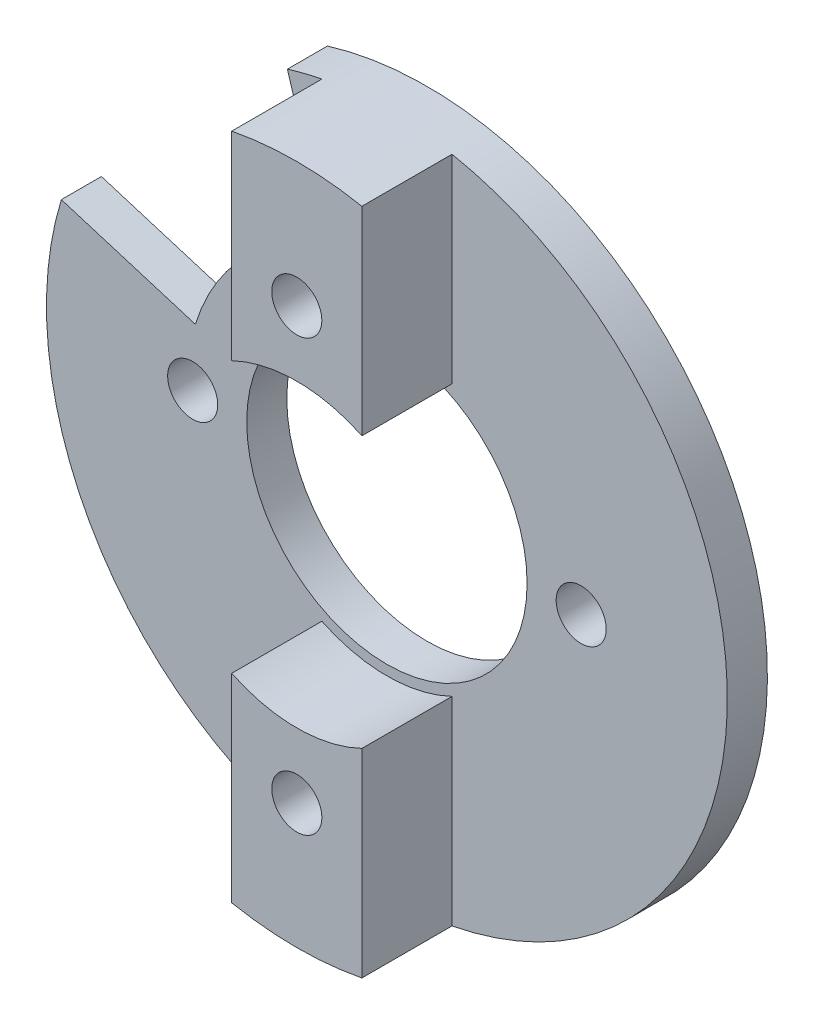
ISO-10303-21;
HEADER;
FILE_DESCRIPTION(('STEP AP214'),'2;1');
FILE_NAME('part.step','',(''),(''),'','','');
FILE_SCHEMA(('AUTOMOTIVE_DESIGN { 1 0 10303 214 1 1 1 1 }'));
ENDSEC;
DATA;
#1=APPLICATION_CONTEXT('core data for automotive mechanical design processes');
#2=APPLICATION_PROTOCOL_DEFINITION('international standard','automotive_design',2000,#1);
#3=PRODUCT_CONTEXT('',#1,'mechanical');
#4=PRODUCT('Part','Part','',(#3));
#5=PRODUCT_RELATED_PRODUCT_CATEGORY('part','',(#4));
#6=PRODUCT_DEFINITION_FORMATION('','',#4);
#7=PRODUCT_DEFINITION_CONTEXT('part definition',#1,'design');
#8=PRODUCT_DEFINITION('design','',#6,#7);
#9=PRODUCT_DEFINITION_SHAPE('','',#8);
#10=(LENGTH_UNIT() NAMED_UNIT(*) SI_UNIT(.MILLI.,.METRE.));
#11=(NAMED_UNIT(*) PLANE_ANGLE_UNIT() SI_UNIT($,.RADIAN.));
#12=(NAMED_UNIT(*) SI_UNIT($,.STERADIAN.) SOLID_ANGLE_UNIT());
#13=UNCERTAINTY_MEASURE_WITH_UNIT(LENGTH_MEASURE(1.E-05),#10,'distance_accuracy_value','');
#14=(GEOMETRIC_REPRESENTATION_CONTEXT(3) GLOBAL_UNCERTAINTY_ASSIGNED_CONTEXT((#13)) GLOBAL_UNIT_ASSIGNED_CONTEXT((#10,
#11,#12)) REPRESENTATION_CONTEXT('',''));
#15=CARTESIAN_POINT('',(0.,0.,0.));
#16=DIRECTION('',(0.,0.,1.));
#17=DIRECTION('',(1.,0.,0.));
#18=AXIS2_PLACEMENT_3D('',#15,#16,#17);
#19=CARTESIAN_POINT('',(0.,0.,2.));
#20=DIRECTION('',(0.,0.,1.));
#21=DIRECTION('',(1.,0.,0.));
#22=AXIS2_PLACEMENT_3D('',#19,#20,#21);
#23=PLANE('',#22);
#24=CARTESIAN_POINT('',(9.7,0.,2.));
#25=DIRECTION('',(0.,0.,-1.));
#26=DIRECTION('',(-1.,0.,0.));
#27=AXIS2_PLACEMENT_3D('',#24,#25,#26);
#28=CIRCLE('',#27,1.25);
#29=CARTESIAN_POINT('',(8.45,0.,2.));
#30=VERTEX_POINT('',#29);
#31=EDGE_CURVE('E363',#30,#30,#28,.T.);
#32=ORIENTED_EDGE('',*,*,#31,.T.);
#33=EDGE_LOOP('',(#32));
#34=FACE_BOUND('',#33,.T.);
#35=CARTESIAN_POINT('',(-9.7,0.,2.));
#36=DIRECTION('',(0.,0.,-1.));
#37=DIRECTION('',(-1.,0.,0.));
#38=AXIS2_PLACEMENT_3D('',#35,#36,#37);
#39=CIRCLE('',#38,1.25);
#40=CARTESIAN_POINT('',(-10.95,0.,2.));
#41=VERTEX_POINT('',#40);
#42=EDGE_CURVE('E367',#41,#41,#39,.T.);
#43=ORIENTED_EDGE('',*,*,#42,.T.);
#44=EDGE_LOOP('',(#43));
#45=FACE_BOUND('',#44,.T.);
#46=CARTESIAN_POINT('',(0.,0.,2.));
#47=DIRECTION('',(0.,0.,-1.));
#48=DIRECTION('',(-1.,0.,0.));
#49=AXIS2_PLACEMENT_3D('',#46,#47,#48);
#50=CIRCLE('',#49,7.);
#51=CARTESIAN_POINT('',(-7.,0.,2.));
#52=VERTEX_POINT('',#51);
#53=EDGE_CURVE('E221',#52,#52,#50,.T.);
#54=ORIENTED_EDGE('',*,*,#53,.T.);
#55=EDGE_LOOP('',(#54));
#56=FACE_BOUND('',#55,.T.);
#57=CARTESIAN_POINT('',(0.,-6.45317133063372E-13,2.));
#58=DIRECTION('',(0.,0.,-1.));
#59=DIRECTION('',(-1.,0.,0.));
#60=AXIS2_PLACEMENT_3D('',#57,#58,#59);
#61=CIRCLE('',#60,7.5);
#62=CARTESIAN_POINT('',(3.24999999999928,-6.75925291729888,2.));
#63=VERTEX_POINT('',#62);
#64=CARTESIAN_POINT('',(-3.25000000000072,-6.75925291729819,2.));
#65=VERTEX_POINT('',#64);
#66=EDGE_CURVE('E56',#63,#65,#61,.T.);
#67=ORIENTED_EDGE('',*,*,#66,.F.);
#68=DIRECTION('',(1.06594205230399E-13,1.,0.));
#69=VECTOR('',#68,1.);
#70=CARTESIAN_POINT('',(3.24999999999822,-16.6864465959669,2.));
#71=LINE('',#70,#69);
#72=CARTESIAN_POINT('',(3.24999999999822,-16.6864465959669,2.));
#73=VERTEX_POINT('',#72);
#74=EDGE_CURVE('E375',#73,#63,#71,.T.);
#75=ORIENTED_EDGE('',*,*,#74,.F.);
#76=CARTESIAN_POINT('',(0.,0.,2.));
#77=DIRECTION('',(0.,0.,1.));
#78=DIRECTION('',(1.,0.,0.));
#79=AXIS2_PLACEMENT_3D('',#76,#77,#78);
#80=CIRCLE('',#79,17.);
#81=CARTESIAN_POINT('',(3.25,16.6864465959652,2.));
#82=VERTEX_POINT('',#81);
#83=EDGE_CURVE('E157',#73,#82,#80,.T.);
#84=ORIENTED_EDGE('',*,*,#83,.T.);
#85=DIRECTION('',(0.,1.,0.));
#86=VECTOR('',#85,1.);
#87=CARTESIAN_POINT('',(3.25,16.6864465959652,2.));
#88=LINE('',#87,#86);
#89=CARTESIAN_POINT('',(3.25,6.75925291729724,2.));
#90=VERTEX_POINT('',#89);
#91=EDGE_CURVE('E168',#90,#82,#88,.T.);
#92=ORIENTED_EDGE('',*,*,#91,.F.);
#93=CARTESIAN_POINT('',(0.,-6.45317133063372E-13,2.));
#94=DIRECTION('',(0.,0.,-1.));
#95=DIRECTION('',(-1.,0.,0.));
#96=AXIS2_PLACEMENT_3D('',#93,#94,#95);
#97=CIRCLE('',#96,7.5);
#98=CARTESIAN_POINT('',(-3.25,6.75925291729724,2.));
#99=VERTEX_POINT('',#98);
#100=EDGE_CURVE('E176',#99,#90,#97,.T.);
#101=ORIENTED_EDGE('',*,*,#100,.F.);
#102=DIRECTION('',(0.,-1.,0.));
#103=VECTOR('',#102,1.);
#104=CARTESIAN_POINT('',(-3.25000000000011,16.6864465959652,2.));
#105=LINE('',#104,#103);
#106=CARTESIAN_POINT('',(-3.25000000000003,9.45714015968886,2.));
#107=VERTEX_POINT('',#106);
#108=EDGE_CURVE('E11',#107,#99,#105,.T.);
#109=ORIENTED_EDGE('',*,*,#108,.F.);
#110=CARTESIAN_POINT('',(0.,0.,2.));
#111=DIRECTION('',(0.,0.,1.));
#112=DIRECTION('',(1.,0.,0.));
#113=AXIS2_PLACEMENT_3D('',#110,#111,#112);
#114=CIRCLE('',#113,10.);
#115=CARTESIAN_POINT('',(-9.56304755963036,2.92371704722737,2.));
#116=VERTEX_POINT('',#115);
#117=EDGE_CURVE('E210',#116,#107,#114,.F.);
#118=ORIENTED_EDGE('',*,*,#117,.F.);
#119=DIRECTION('',(-0.956304755963036,0.292371704722736,0.));
#120=VECTOR('',#119,1.);
#121=CARTESIAN_POINT('',(0.,0.,2.));
#122=LINE('',#121,#120);
#123=CARTESIAN_POINT('',(-16.2571808513716,4.97031898028652,2.));
#124=VERTEX_POINT('',#123);
#125=EDGE_CURVE('E213',#116,#124,#122,.T.);
#126=ORIENTED_EDGE('',*,*,#125,.T.);
#127=CARTESIAN_POINT('',(-3.25000000000153,-16.6864465959649,2.));
#128=VERTEX_POINT('',#127);
#129=EDGE_CURVE('E46',#124,#128,#80,.T.);
#130=ORIENTED_EDGE('',*,*,#129,.T.);
#131=DIRECTION('',(-1.06594205230399E-13,-1.,0.));
#132=VECTOR('',#131,1.);
#133=CARTESIAN_POINT('',(-3.25000000000178,-16.6864465959662,2.));
#134=LINE('',#133,#132);
#135=EDGE_CURVE('E61',#65,#128,#134,.T.);
#136=ORIENTED_EDGE('',*,*,#135,.F.);
#137=EDGE_LOOP('',(#67,#75,#84,#92,#101,#109,#118,#126,#130,#136));
#138=FACE_BOUND('',#137,.T.);
#139=ADVANCED_FACE('F37',(#34,#45,#56,#138),#23,.T.);
#140=CARTESIAN_POINT('',(-3.25000000000011,16.6864465959652,2.));
#141=VERTEX_POINT('',#140);
#142=CARTESIAN_POINT('',(-3.25000000000005,10.6302710100736,2.));
#143=VERTEX_POINT('',#142);
#144=EDGE_CURVE('E48',#141,#143,#105,.T.);
#145=ORIENTED_EDGE('',*,*,#144,.F.);
#146=CARTESIAN_POINT('',(-4.97031898028651,16.2571808513716,2.));
#147=VERTEX_POINT('',#146);
#148=EDGE_CURVE('E225',#141,#147,#80,.T.);
#149=ORIENTED_EDGE('',*,*,#148,.T.);
#150=DIRECTION('',(-0.292371704722736,0.956304755963036,0.));
#151=VECTOR('',#150,1.);
#152=CARTESIAN_POINT('',(0.,0.,2.));
#153=LINE('',#152,#151);
#154=EDGE_CURVE('E216',#143,#147,#153,.T.);
#155=ORIENTED_EDGE('',*,*,#154,.F.);
#156=EDGE_LOOP('',(#145,#149,#155));
#157=FACE_BOUND('',#156,.T.);
#158=ADVANCED_FACE('F252',(#157),#23,.T.);
#159=CARTESIAN_POINT('',(0.,0.,0.));
#160=DIRECTION('',(0.,0.,1.));
#161=DIRECTION('',(1.,0.,0.));
#162=AXIS2_PLACEMENT_3D('',#159,#160,#161);
#163=PLANE('',#162);
#164=CARTESIAN_POINT('',(9.7,0.,0.));
#165=DIRECTION('',(0.,0.,-1.));
#166=DIRECTION('',(-1.,0.,0.));
#167=AXIS2_PLACEMENT_3D('',#164,#165,#166);
#168=CIRCLE('',#167,1.25);
#169=CARTESIAN_POINT('',(8.45,0.,0.));
#170=VERTEX_POINT('',#169);
#171=EDGE_CURVE('E291',#170,#170,#168,.T.);
#172=ORIENTED_EDGE('',*,*,#171,.F.);
#173=EDGE_LOOP('',(#172));
#174=FACE_BOUND('',#173,.T.);
#175=CARTESIAN_POINT('',(-9.7,0.,0.));
#176=DIRECTION('',(0.,0.,-1.));
#177=DIRECTION('',(-1.,0.,0.));
#178=AXIS2_PLACEMENT_3D('',#175,#176,#177);
#179=CIRCLE('',#178,1.25);
#180=CARTESIAN_POINT('',(-10.95,0.,0.));
#181=VERTEX_POINT('',#180);
#182=EDGE_CURVE('E295',#181,#181,#179,.T.);
#183=ORIENTED_EDGE('',*,*,#182,.F.);
#184=EDGE_LOOP('',(#183));
#185=FACE_BOUND('',#184,.T.);
#186=CARTESIAN_POINT('',(0.,0.,0.));
#187=DIRECTION('',(0.,0.,-1.));
#188=DIRECTION('',(-1.,0.,0.));
#189=AXIS2_PLACEMENT_3D('',#186,#187,#188);
#190=CIRCLE('',#189,7.);
#191=CARTESIAN_POINT('',(-7.,0.,0.));
#192=VERTEX_POINT('',#191);
#193=EDGE_CURVE('E220',#192,#192,#190,.T.);
#194=ORIENTED_EDGE('',*,*,#193,.F.);
#195=EDGE_LOOP('',(#194));
#196=FACE_BOUND('',#195,.T.);
#197=CARTESIAN_POINT('',(0.,0.,0.));
#198=DIRECTION('',(0.,0.,-1.));
#199=DIRECTION('',(-1.,0.,0.));
#200=AXIS2_PLACEMENT_3D('',#197,#198,#199);
#201=CIRCLE('',#200,10.);
#202=CARTESIAN_POINT('',(-2.92371704722736,9.56304755963036,0.));
#203=VERTEX_POINT('',#202);
#204=CARTESIAN_POINT('',(-9.56304755963036,2.92371704722737,0.));
#205=VERTEX_POINT('',#204);
#206=EDGE_CURVE('E193',#203,#205,#201,.F.);
#207=ORIENTED_EDGE('',*,*,#206,.F.);
#208=DIRECTION('',(0.292371704722736,-0.956304755963036,0.));
#209=VECTOR('',#208,1.);
#210=CARTESIAN_POINT('',(0.,0.,0.));
#211=LINE('',#210,#209);
#212=CARTESIAN_POINT('',(-4.97031898028651,16.2571808513716,0.));
#213=VERTEX_POINT('',#212);
#214=EDGE_CURVE('E191',#213,#203,#211,.T.);
#215=ORIENTED_EDGE('',*,*,#214,.F.);
#216=CARTESIAN_POINT('',(0.,0.,0.));
#217=DIRECTION('',(0.,0.,1.));
#218=DIRECTION('',(1.,0.,0.));
#219=AXIS2_PLACEMENT_3D('',#216,#217,#218);
#220=CIRCLE('',#219,17.);
#221=CARTESIAN_POINT('',(-16.2571808513716,4.97031898028652,0.));
#222=VERTEX_POINT('',#221);
#223=EDGE_CURVE('E41',#222,#213,#220,.T.);
#224=ORIENTED_EDGE('',*,*,#223,.F.);
#225=DIRECTION('',(0.956304755963036,-0.292371704722736,0.));
#226=VECTOR('',#225,1.);
#227=CARTESIAN_POINT('',(0.,0.,0.));
#228=LINE('',#227,#226);
#229=EDGE_CURVE('E196',#222,#205,#228,.T.);
#230=ORIENTED_EDGE('',*,*,#229,.T.);
#231=EDGE_LOOP('',(#207,#215,#224,#230));
#232=FACE_BOUND('',#231,.T.);
#233=ADVANCED_FACE('F235',(#174,#185,#196,#232),#163,.F.);
#234=CARTESIAN_POINT('',(0.,0.,2.));
#235=DIRECTION('',(0.,0.,-1.));
#236=DIRECTION('',(-1.,0.,0.));
#237=AXIS2_PLACEMENT_3D('',#234,#235,#236);
#238=CYLINDRICAL_SURFACE('',#237,17.);
#239=ORIENTED_EDGE('',*,*,#223,.T.);
#240=DIRECTION('',(0.,0.,-1.));
#241=VECTOR('',#240,1.);
#242=CARTESIAN_POINT('',(-4.97031898028651,16.2571808513716,2.5));
#243=LINE('',#242,#241);
#244=EDGE_CURVE('E200',#147,#213,#243,.T.);
#245=ORIENTED_EDGE('',*,*,#244,.F.);
#246=ORIENTED_EDGE('',*,*,#148,.F.);
#247=DIRECTION('',(0.,0.,-1.));
#248=VECTOR('',#247,1.);
#249=CARTESIAN_POINT('',(-3.25000000000011,16.6864465959652,6.5));
#250=LINE('',#249,#248);
#251=CARTESIAN_POINT('',(-3.25000000000011,16.6864465959652,6.5));
#252=VERTEX_POINT('',#251);
#253=EDGE_CURVE('E188',#252,#141,#250,.T.);
#254=ORIENTED_EDGE('',*,*,#253,.F.);
#255=CARTESIAN_POINT('',(0.,-6.45317133063372E-13,6.5));
#256=DIRECTION('',(0.,0.,1.));
#257=DIRECTION('',(-1.,0.,0.));
#258=AXIS2_PLACEMENT_3D('',#255,#256,#257);
#259=CIRCLE('',#258,17.0000000000006);
#260=CARTESIAN_POINT('',(3.25,16.6864465959652,6.5));
#261=VERTEX_POINT('',#260);
#262=EDGE_CURVE('E164',#261,#252,#259,.T.);
#263=ORIENTED_EDGE('',*,*,#262,.F.);
#264=DIRECTION('',(0.,0.,-1.));
#265=VECTOR('',#264,1.);
#266=CARTESIAN_POINT('',(3.25,16.6864465959652,6.5));
#267=LINE('',#266,#265);
#268=EDGE_CURVE('E173',#261,#82,#267,.T.);
#269=ORIENTED_EDGE('',*,*,#268,.T.);
#270=ORIENTED_EDGE('',*,*,#83,.F.);
#271=DIRECTION('',(0.,0.,-1.));
#272=VECTOR('',#271,1.);
#273=CARTESIAN_POINT('',(3.24999999999822,-16.6864465959669,6.5));
#274=LINE('',#273,#272);
#275=CARTESIAN_POINT('',(3.24999999999822,-16.6864465959669,6.5));
#276=VERTEX_POINT('',#275);
#277=EDGE_CURVE('E139',#276,#73,#274,.T.);
#278=ORIENTED_EDGE('',*,*,#277,.F.);
#279=CARTESIAN_POINT('',(0.,-6.45317133063372E-13,6.5));
#280=DIRECTION('',(0.,0.,1.));
#281=DIRECTION('',(-1.,0.,0.));
#282=AXIS2_PLACEMENT_3D('',#279,#280,#281);
#283=CIRCLE('',#282,17.0000000000006);
#284=CARTESIAN_POINT('',(-3.25000000000178,-16.6864465959662,6.5));
#285=VERTEX_POINT('',#284);
#286=EDGE_CURVE('E145',#285,#276,#283,.T.);
#287=ORIENTED_EDGE('',*,*,#286,.F.);
#288=DIRECTION('',(0.,0.,-1.));
#289=VECTOR('',#288,1.);
#290=CARTESIAN_POINT('',(-3.25000000000178,-16.6864465959662,6.5));
#291=LINE('',#290,#289);
#292=EDGE_CURVE('E386',#285,#128,#291,.T.);
#293=ORIENTED_EDGE('',*,*,#292,.T.);
#294=ORIENTED_EDGE('',*,*,#129,.F.);
#295=DIRECTION('',(0.,0.,-1.));
#296=VECTOR('',#295,1.);
#297=CARTESIAN_POINT('',(-16.2571808513716,4.97031898028652,2.5));
#298=LINE('',#297,#296);
#299=EDGE_CURVE('E203',#124,#222,#298,.T.);
#300=ORIENTED_EDGE('',*,*,#299,.T.);
#301=EDGE_LOOP('',(#239,#245,#246,#254,#263,#269,#270,#278,#287,#293,#294,#300));
#302=FACE_BOUND('',#301,.T.);
#303=ADVANCED_FACE('F39',(#302),#238,.T.);
#304=CARTESIAN_POINT('',(0.,0.,2.));
#305=DIRECTION('',(0.,0.,-1.));
#306=DIRECTION('',(-1.,0.,0.));
#307=AXIS2_PLACEMENT_3D('',#304,#305,#306);
#308=CYLINDRICAL_SURFACE('',#307,7.);
#309=ORIENTED_EDGE('',*,*,#53,.F.);
#310=EDGE_LOOP('',(#309));
#311=FACE_BOUND('',#310,.T.);
#312=ORIENTED_EDGE('',*,*,#193,.T.);
#313=EDGE_LOOP('',(#312));
#314=FACE_BOUND('',#313,.T.);
#315=ADVANCED_FACE('F281',(#311,#314),#308,.F.);
#316=CARTESIAN_POINT('',(0.,0.,2.5));
#317=DIRECTION('',(0.956304755963036,0.292371704722736,0.));
#318=DIRECTION('',(-0.292371704722736,0.956304755963036,0.));
#319=AXIS2_PLACEMENT_3D('',#316,#317,#318);
#320=PLANE('',#319);
#321=CARTESIAN_POINT('',(-2.92371704722736,9.56304755963036,2.));
#322=VERTEX_POINT('',#321);
#323=EDGE_CURVE('E217',#322,#143,#153,.T.);
#324=ORIENTED_EDGE('',*,*,#323,.T.);
#325=ORIENTED_EDGE('',*,*,#154,.T.);
#326=ORIENTED_EDGE('',*,*,#244,.T.);
#327=ORIENTED_EDGE('',*,*,#214,.T.);
#328=DIRECTION('',(0.,0.,-1.));
#329=VECTOR('',#328,1.);
#330=CARTESIAN_POINT('',(-2.92371704722736,9.56304755963036,2.5));
#331=LINE('',#330,#329);
#332=EDGE_CURVE('E199',#322,#203,#331,.T.);
#333=ORIENTED_EDGE('',*,*,#332,.F.);
#334=EDGE_LOOP('',(#324,#325,#326,#327,#333));
#335=FACE_BOUND('',#334,.T.);
#336=ADVANCED_FACE('F238',(#335),#320,.F.);
#337=CARTESIAN_POINT('',(0.,0.,2.5));
#338=DIRECTION('',(0.292371704722736,0.956304755963036,0.));
#339=DIRECTION('',(-0.956304755963036,0.292371704722736,0.));
#340=AXIS2_PLACEMENT_3D('',#337,#338,#339);
#341=PLANE('',#340);
#342=DIRECTION('',(0.,0.,-1.));
#343=VECTOR('',#342,1.);
#344=CARTESIAN_POINT('',(-9.56304755963036,2.92371704722737,2.5));
#345=LINE('',#344,#343);
#346=EDGE_CURVE('E206',#116,#205,#345,.T.);
#347=ORIENTED_EDGE('',*,*,#346,.T.);
#348=ORIENTED_EDGE('',*,*,#229,.F.);
#349=ORIENTED_EDGE('',*,*,#299,.F.);
#350=ORIENTED_EDGE('',*,*,#125,.F.);
#351=EDGE_LOOP('',(#347,#348,#349,#350));
#352=FACE_BOUND('',#351,.T.);
#353=ADVANCED_FACE('F303',(#352),#341,.T.);
#354=CARTESIAN_POINT('',(0.,0.,2.5));
#355=DIRECTION('',(0.,0.,-1.));
#356=DIRECTION('',(-1.,0.,0.));
#357=AXIS2_PLACEMENT_3D('',#354,#355,#356);
#358=CYLINDRICAL_SURFACE('',#357,10.);
#359=ORIENTED_EDGE('',*,*,#117,.T.);
#360=EDGE_CURVE('E202',#107,#322,#114,.F.);
#361=ORIENTED_EDGE('',*,*,#360,.T.);
#362=ORIENTED_EDGE('',*,*,#332,.T.);
#363=ORIENTED_EDGE('',*,*,#206,.T.);
#364=ORIENTED_EDGE('',*,*,#346,.F.);
#365=EDGE_LOOP('',(#359,#361,#362,#363,#364));
#366=FACE_BOUND('',#365,.T.);
#367=ADVANCED_FACE('F241',(#366),#358,.T.);
#368=CARTESIAN_POINT('',(0.,-6.45317133063372E-13,2.));
#369=DIRECTION('',(0.,0.,-1.));
#370=DIRECTION('',(-1.,0.,0.));
#371=AXIS2_PLACEMENT_3D('',#368,#369,#370);
#372=PLANE('',#371);
#373=ORIENTED_EDGE('',*,*,#323,.F.);
#374=ORIENTED_EDGE('',*,*,#360,.F.);
#375=EDGE_CURVE('E49',#143,#107,#105,.T.);
#376=ORIENTED_EDGE('',*,*,#375,.F.);
#377=EDGE_LOOP('',(#373,#374,#376));
#378=FACE_BOUND('',#377,.T.);
#379=ADVANCED_FACE('F247',(#378),#372,.T.);
#380=CARTESIAN_POINT('',(-3.25000000000011,16.6864465959652,6.5));
#381=DIRECTION('',(1.,0.,0.));
#382=DIRECTION('',(0.,1.,0.));
#383=AXIS2_PLACEMENT_3D('',#380,#381,#382);
#384=PLANE('',#383);
#385=ORIENTED_EDGE('',*,*,#144,.T.);
#386=ORIENTED_EDGE('',*,*,#375,.T.);
#387=ORIENTED_EDGE('',*,*,#108,.T.);
#388=DIRECTION('',(0.,0.,-1.));
#389=VECTOR('',#388,1.);
#390=CARTESIAN_POINT('',(-3.25,6.75925291729724,6.5));
#391=LINE('',#390,#389);
#392=CARTESIAN_POINT('',(-3.25,6.75925291729724,6.5));
#393=VERTEX_POINT('',#392);
#394=EDGE_CURVE('E185',#393,#99,#391,.T.);
#395=ORIENTED_EDGE('',*,*,#394,.F.);
#396=DIRECTION('',(0.,-1.,0.));
#397=VECTOR('',#396,1.);
#398=CARTESIAN_POINT('',(-3.25000000000011,16.6864465959652,6.5));
#399=LINE('',#398,#397);
#400=EDGE_CURVE('E167',#252,#393,#399,.T.);
#401=ORIENTED_EDGE('',*,*,#400,.F.);
#402=ORIENTED_EDGE('',*,*,#253,.T.);
#403=EDGE_LOOP('',(#385,#386,#387,#395,#401,#402));
#404=FACE_BOUND('',#403,.T.);
#405=ADVANCED_FACE('F249',(#404),#384,.F.);
#406=CARTESIAN_POINT('',(0.,-6.45317133063372E-13,6.5));
#407=DIRECTION('',(0.,0.,-1.));
#408=DIRECTION('',(-1.,0.,0.));
#409=AXIS2_PLACEMENT_3D('',#406,#407,#408);
#410=CYLINDRICAL_SURFACE('',#409,7.5);
#411=ORIENTED_EDGE('',*,*,#100,.T.);
#412=DIRECTION('',(0.,0.,-1.));
#413=VECTOR('',#412,1.);
#414=CARTESIAN_POINT('',(3.25,6.75925291729724,6.5));
#415=LINE('',#414,#413);
#416=CARTESIAN_POINT('',(3.25,6.75925291729724,6.5));
#417=VERTEX_POINT('',#416);
#418=EDGE_CURVE('E182',#417,#90,#415,.T.);
#419=ORIENTED_EDGE('',*,*,#418,.F.);
#420=CARTESIAN_POINT('',(0.,-6.45317133063372E-13,6.5));
#421=DIRECTION('',(0.,0.,-1.));
#422=DIRECTION('',(-1.,0.,0.));
#423=AXIS2_PLACEMENT_3D('',#420,#421,#422);
#424=CIRCLE('',#423,7.5);
#425=EDGE_CURVE('E170',#393,#417,#424,.T.);
#426=ORIENTED_EDGE('',*,*,#425,.F.);
#427=ORIENTED_EDGE('',*,*,#394,.T.);
#428=EDGE_LOOP('',(#411,#419,#426,#427));
#429=FACE_BOUND('',#428,.T.);
#430=ADVANCED_FACE('F263',(#429),#410,.F.);
#431=CARTESIAN_POINT('',(3.25,16.6864465959652,6.5));
#432=DIRECTION('',(-1.,0.,0.));
#433=DIRECTION('',(0.,-1.,0.));
#434=AXIS2_PLACEMENT_3D('',#431,#432,#433);
#435=PLANE('',#434);
#436=ORIENTED_EDGE('',*,*,#91,.T.);
#437=ORIENTED_EDGE('',*,*,#268,.F.);
#438=DIRECTION('',(0.,1.,0.));
#439=VECTOR('',#438,1.);
#440=CARTESIAN_POINT('',(3.25,16.6864465959652,6.5));
#441=LINE('',#440,#439);
#442=EDGE_CURVE('E172',#417,#261,#441,.T.);
#443=ORIENTED_EDGE('',*,*,#442,.F.);
#444=ORIENTED_EDGE('',*,*,#418,.T.);
#445=EDGE_LOOP('',(#436,#437,#443,#444));
#446=FACE_BOUND('',#445,.T.);
#447=ADVANCED_FACE('F261',(#446),#435,.F.);
#448=CARTESIAN_POINT('',(0.,-6.45317133063372E-13,6.5));
#449=DIRECTION('',(0.,0.,-1.));
#450=DIRECTION('',(-1.,0.,0.));
#451=AXIS2_PLACEMENT_3D('',#448,#449,#450);
#452=PLANE('',#451);
#453=CARTESIAN_POINT('',(0.,10.75,6.5));
#454=DIRECTION('',(0.,0.,1.));
#455=DIRECTION('',(1.,0.,0.));
#456=AXIS2_PLACEMENT_3D('',#453,#454,#455);
#457=CIRCLE('',#456,1.25);
#458=CARTESIAN_POINT('',(1.25,10.75,6.5));
#459=VERTEX_POINT('',#458);
#460=EDGE_CURVE('E376',#459,#459,#457,.T.);
#461=ORIENTED_EDGE('',*,*,#460,.F.);
#462=EDGE_LOOP('',(#461));
#463=FACE_BOUND('',#462,.T.);
#464=ORIENTED_EDGE('',*,*,#262,.T.);
#465=ORIENTED_EDGE('',*,*,#400,.T.);
#466=ORIENTED_EDGE('',*,*,#425,.T.);
#467=ORIENTED_EDGE('',*,*,#442,.T.);
#468=EDGE_LOOP('',(#464,#465,#466,#467));
#469=FACE_BOUND('',#468,.T.);
#470=ADVANCED_FACE('F256',(#463,#469),#452,.F.);
#471=CARTESIAN_POINT('',(3.24999999999822,-16.6864465959669,6.5));
#472=DIRECTION('',(-1.,1.06594205230399E-13,0.));
#473=DIRECTION('',(-1.06594205230399E-13,-1.,0.));
#474=AXIS2_PLACEMENT_3D('',#471,#472,#473);
#475=PLANE('',#474);
#476=ORIENTED_EDGE('',*,*,#74,.T.);
#477=DIRECTION('',(0.,0.,-1.));
#478=VECTOR('',#477,1.);
#479=CARTESIAN_POINT('',(3.24999999999928,-6.75925291729888,6.5));
#480=LINE('',#479,#478);
#481=CARTESIAN_POINT('',(3.24999999999928,-6.75925291729888,6.5));
#482=VERTEX_POINT('',#481);
#483=EDGE_CURVE('E141',#482,#63,#480,.T.);
#484=ORIENTED_EDGE('',*,*,#483,.F.);
#485=DIRECTION('',(1.06594205230399E-13,1.,0.));
#486=VECTOR('',#485,1.);
#487=CARTESIAN_POINT('',(3.24999999999822,-16.6864465959669,6.5));
#488=LINE('',#487,#486);
#489=EDGE_CURVE('E135',#276,#482,#488,.T.);
#490=ORIENTED_EDGE('',*,*,#489,.F.);
#491=ORIENTED_EDGE('',*,*,#277,.T.);
#492=EDGE_LOOP('',(#476,#484,#490,#491));
#493=FACE_BOUND('',#492,.T.);
#494=ADVANCED_FACE('F137',(#493),#475,.F.);
#495=CARTESIAN_POINT('',(0.,-6.45317133063372E-13,6.5));
#496=DIRECTION('',(0.,0.,-1.));
#497=DIRECTION('',(-1.,0.,0.));
#498=AXIS2_PLACEMENT_3D('',#495,#496,#497);
#499=CYLINDRICAL_SURFACE('',#498,7.5);
#500=ORIENTED_EDGE('',*,*,#66,.T.);
#501=DIRECTION('',(0.,0.,-1.));
#502=VECTOR('',#501,1.);
#503=CARTESIAN_POINT('',(-3.25000000000072,-6.75925291729819,6.5));
#504=LINE('',#503,#502);
#505=CARTESIAN_POINT('',(-3.25000000000072,-6.75925291729819,6.5));
#506=VERTEX_POINT('',#505);
#507=EDGE_CURVE('E160',#506,#65,#504,.T.);
#508=ORIENTED_EDGE('',*,*,#507,.F.);
#509=CARTESIAN_POINT('',(0.,-6.45317133063372E-13,6.5));
#510=DIRECTION('',(0.,0.,-1.));
#511=DIRECTION('',(-1.,0.,0.));
#512=AXIS2_PLACEMENT_3D('',#509,#510,#511);
#513=CIRCLE('',#512,7.5);
#514=EDGE_CURVE('E144',#482,#506,#513,.T.);
#515=ORIENTED_EDGE('',*,*,#514,.F.);
#516=ORIENTED_EDGE('',*,*,#483,.T.);
#517=EDGE_LOOP('',(#500,#508,#515,#516));
#518=FACE_BOUND('',#517,.T.);
#519=ADVANCED_FACE('F325',(#518),#499,.F.);
#520=CARTESIAN_POINT('',(-3.25000000000178,-16.6864465959662,6.5));
#521=DIRECTION('',(1.,-1.06594205230399E-13,0.));
#522=DIRECTION('',(1.06594205230399E-13,1.,0.));
#523=AXIS2_PLACEMENT_3D('',#520,#521,#522);
#524=PLANE('',#523);
#525=ORIENTED_EDGE('',*,*,#135,.T.);
#526=ORIENTED_EDGE('',*,*,#292,.F.);
#527=DIRECTION('',(-1.06594205230399E-13,-1.,0.));
#528=VECTOR('',#527,1.);
#529=CARTESIAN_POINT('',(-3.25000000000178,-16.6864465959662,6.5));
#530=LINE('',#529,#528);
#531=EDGE_CURVE('E150',#506,#285,#530,.T.);
#532=ORIENTED_EDGE('',*,*,#531,.F.);
#533=ORIENTED_EDGE('',*,*,#507,.T.);
#534=EDGE_LOOP('',(#525,#526,#532,#533));
#535=FACE_BOUND('',#534,.T.);
#536=ADVANCED_FACE('F328',(#535),#524,.F.);
#537=CARTESIAN_POINT('',(0.,-6.45317133063372E-13,6.5));
#538=DIRECTION('',(0.,0.,-1.));
#539=DIRECTION('',(-1.,0.,0.));
#540=AXIS2_PLACEMENT_3D('',#537,#538,#539);
#541=PLANE('',#540);
#542=CARTESIAN_POINT('',(0.,-10.7500000000001,6.5));
#543=DIRECTION('',(0.,0.,1.));
#544=DIRECTION('',(-1.,0.,0.));
#545=AXIS2_PLACEMENT_3D('',#542,#543,#544);
#546=CIRCLE('',#545,1.25);
#547=CARTESIAN_POINT('',(-1.24999999999994,-10.7500000000001,6.5));
#548=VERTEX_POINT('',#547);
#549=EDGE_CURVE('E365',#548,#548,#546,.T.);
#550=ORIENTED_EDGE('',*,*,#549,.F.);
#551=EDGE_LOOP('',(#550));
#552=FACE_BOUND('',#551,.T.);
#553=ORIENTED_EDGE('',*,*,#286,.T.);
#554=ORIENTED_EDGE('',*,*,#489,.T.);
#555=ORIENTED_EDGE('',*,*,#514,.T.);
#556=ORIENTED_EDGE('',*,*,#531,.T.);
#557=EDGE_LOOP('',(#553,#554,#555,#556));
#558=FACE_BOUND('',#557,.T.);
#559=ADVANCED_FACE('F148',(#552,#558),#541,.F.);
#560=CARTESIAN_POINT('',(0.,-10.7500000000001,2.5));
#561=DIRECTION('',(0.,0.,1.));
#562=DIRECTION('',(1.,0.,0.));
#563=AXIS2_PLACEMENT_3D('',#560,#561,#562);
#564=CYLINDRICAL_SURFACE('',#563,1.25);
#565=CARTESIAN_POINT('',(0.,-10.7500000000001,2.5));
#566=DIRECTION('',(0.,0.,1.));
#567=DIRECTION('',(-1.,0.,0.));
#568=AXIS2_PLACEMENT_3D('',#565,#566,#567);
#569=CIRCLE('',#568,1.25);
#570=CARTESIAN_POINT('',(-1.24999999999994,-10.7500000000001,2.5));
#571=VERTEX_POINT('',#570);
#572=EDGE_CURVE('E379',#571,#571,#569,.T.);
#573=ORIENTED_EDGE('',*,*,#572,.F.);
#574=EDGE_LOOP('',(#573));
#575=FACE_BOUND('',#574,.T.);
#576=ORIENTED_EDGE('',*,*,#549,.T.);
#577=EDGE_LOOP('',(#576));
#578=FACE_BOUND('',#577,.T.);
#579=ADVANCED_FACE('F335',(#575,#578),#564,.F.);
#580=CARTESIAN_POINT('',(0.,-10.7500000000001,2.5));
#581=DIRECTION('',(0.,0.,-1.));
#582=DIRECTION('',(-1.,0.,0.));
#583=AXIS2_PLACEMENT_3D('',#580,#581,#582);
#584=PLANE('',#583);
#585=ORIENTED_EDGE('',*,*,#572,.T.);
#586=EDGE_LOOP('',(#585));
#587=FACE_BOUND('',#586,.T.);
#588=ADVANCED_FACE('F339',(#587),#584,.F.);
#589=CARTESIAN_POINT('',(0.,10.75,2.5));
#590=DIRECTION('',(0.,0.,1.));
#591=DIRECTION('',(1.,0.,0.));
#592=AXIS2_PLACEMENT_3D('',#589,#590,#591);
#593=CYLINDRICAL_SURFACE('',#592,1.25);
#594=CARTESIAN_POINT('',(0.,10.75,2.5));
#595=DIRECTION('',(0.,0.,1.));
#596=DIRECTION('',(1.,0.,0.));
#597=AXIS2_PLACEMENT_3D('',#594,#595,#596);
#598=CIRCLE('',#597,1.25);
#599=CARTESIAN_POINT('',(1.25,10.75,2.5));
#600=VERTEX_POINT('',#599);
#601=EDGE_CURVE('E372',#600,#600,#598,.T.);
#602=ORIENTED_EDGE('',*,*,#601,.F.);
#603=EDGE_LOOP('',(#602));
#604=FACE_BOUND('',#603,.T.);
#605=ORIENTED_EDGE('',*,*,#460,.T.);
#606=EDGE_LOOP('',(#605));
#607=FACE_BOUND('',#606,.T.);
#608=ADVANCED_FACE('F343',(#604,#607),#593,.F.);
#609=CARTESIAN_POINT('',(0.,10.75,2.5));
#610=DIRECTION('',(0.,0.,1.));
#611=DIRECTION('',(1.,0.,0.));
#612=AXIS2_PLACEMENT_3D('',#609,#610,#611);
#613=PLANE('',#612);
#614=ORIENTED_EDGE('',*,*,#601,.T.);
#615=EDGE_LOOP('',(#614));
#616=FACE_BOUND('',#615,.T.);
#617=ADVANCED_FACE('F347',(#616),#613,.T.);
#618=CARTESIAN_POINT('',(-9.7,0.,2.));
#619=DIRECTION('',(0.,0.,-1.));
#620=DIRECTION('',(-1.,0.,0.));
#621=AXIS2_PLACEMENT_3D('',#618,#619,#620);
#622=CYLINDRICAL_SURFACE('',#621,1.25);
#623=ORIENTED_EDGE('',*,*,#42,.F.);
#624=EDGE_LOOP('',(#623));
#625=FACE_BOUND('',#624,.T.);
#626=ORIENTED_EDGE('',*,*,#182,.T.);
#627=EDGE_LOOP('',(#626));
#628=FACE_BOUND('',#627,.T.);
#629=ADVANCED_FACE('F351',(#625,#628),#622,.F.);
#630=CARTESIAN_POINT('',(9.7,0.,2.));
#631=DIRECTION('',(0.,0.,-1.));
#632=DIRECTION('',(-1.,0.,0.));
#633=AXIS2_PLACEMENT_3D('',#630,#631,#632);
#634=CYLINDRICAL_SURFACE('',#633,1.25);
#635=ORIENTED_EDGE('',*,*,#31,.F.);
#636=EDGE_LOOP('',(#635));
#637=FACE_BOUND('',#636,.T.);
#638=ORIENTED_EDGE('',*,*,#171,.T.);
#639=EDGE_LOOP('',(#638));
#640=FACE_BOUND('',#639,.T.);
#641=ADVANCED_FACE('F355',(#637,#640),#634,.F.);
#642=CLOSED_SHELL('',(#139,#158,#233,#303,#315,#336,#353,#367,#379,#405,#430,#447,#470,#494,
#519,#536,#559,#579,#588,#608,#617,#629,#641));
#643=MANIFOLD_SOLID_BREP('B2',#642);
#644=ADVANCED_BREP_SHAPE_REPRESENTATION('',(#18,#643),#14);
#645=SHAPE_DEFINITION_REPRESENTATION(#9,#644);
ENDSEC;
END-ISO-10303-21;
